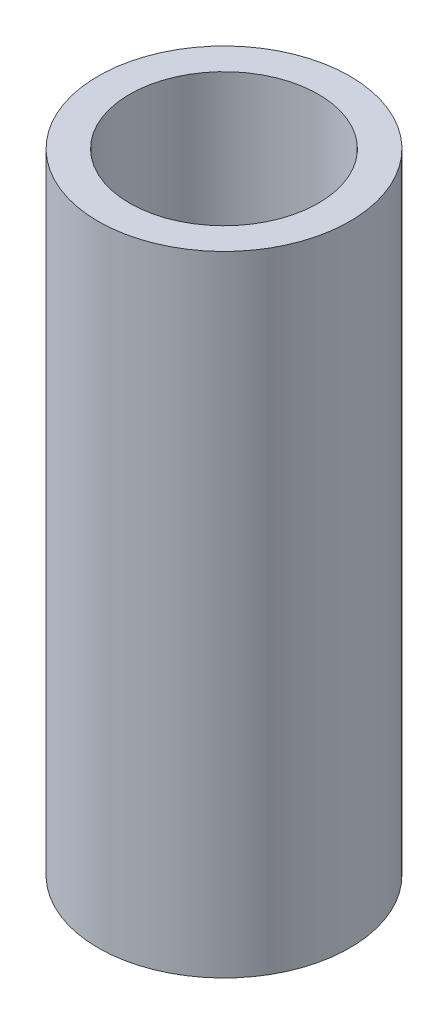
ISO-10303-21;
HEADER;
FILE_DESCRIPTION(('STEP AP214'),'2;1');
FILE_NAME('part.step','',(''),(''),'','','');
FILE_SCHEMA(('AUTOMOTIVE_DESIGN { 1 0 10303 214 1 1 1 1 }'));
ENDSEC;
DATA;
#1=APPLICATION_CONTEXT('core data for automotive mechanical design processes');
#2=APPLICATION_PROTOCOL_DEFINITION('international standard','automotive_design',2000,#1);
#3=PRODUCT_CONTEXT('',#1,'mechanical');
#4=PRODUCT('Part','Part','',(#3));
#5=PRODUCT_RELATED_PRODUCT_CATEGORY('part','',(#4));
#6=PRODUCT_DEFINITION_FORMATION('','',#4);
#7=PRODUCT_DEFINITION_CONTEXT('part definition',#1,'design');
#8=PRODUCT_DEFINITION('design','',#6,#7);
#9=PRODUCT_DEFINITION_SHAPE('','',#8);
#10=(LENGTH_UNIT() NAMED_UNIT(*) SI_UNIT(.MILLI.,.METRE.));
#11=(NAMED_UNIT(*) PLANE_ANGLE_UNIT() SI_UNIT($,.RADIAN.));
#12=(NAMED_UNIT(*) SI_UNIT($,.STERADIAN.) SOLID_ANGLE_UNIT());
#13=UNCERTAINTY_MEASURE_WITH_UNIT(LENGTH_MEASURE(1.E-05),#10,'distance_accuracy_value','');
#14=(GEOMETRIC_REPRESENTATION_CONTEXT(3) GLOBAL_UNCERTAINTY_ASSIGNED_CONTEXT((#13)) GLOBAL_UNIT_ASSIGNED_CONTEXT((#10,
#11,#12)) REPRESENTATION_CONTEXT('',''));
#15=CARTESIAN_POINT('',(0.,0.,0.));
#16=DIRECTION('',(0.,0.,1.));
#17=DIRECTION('',(1.,0.,0.));
#18=AXIS2_PLACEMENT_3D('',#15,#16,#17);
#19=CARTESIAN_POINT('',(0.,50.8,0.));
#20=DIRECTION('',(0.,1.,0.));
#21=DIRECTION('',(0.,0.,1.));
#22=AXIS2_PLACEMENT_3D('',#19,#20,#21);
#23=PLANE('',#22);
#24=CARTESIAN_POINT('',(0.,50.8,0.));
#25=DIRECTION('',(0.,1.,0.));
#26=DIRECTION('',(0.,0.,1.));
#27=AXIS2_PLACEMENT_3D('',#24,#25,#26);
#28=CIRCLE('',#27,10.16);
#29=CARTESIAN_POINT('',(0.,50.8,10.16));
#30=VERTEX_POINT('',#29);
#31=EDGE_CURVE('E10',#30,#30,#28,.T.);
#32=ORIENTED_EDGE('',*,*,#31,.T.);
#33=EDGE_LOOP('',(#32));
#34=FACE_BOUND('',#33,.T.);
#35=CARTESIAN_POINT('',(0.,50.8,0.));
#36=DIRECTION('',(0.,1.,0.));
#37=DIRECTION('',(0.,0.,1.));
#38=AXIS2_PLACEMENT_3D('',#35,#36,#37);
#39=CIRCLE('',#38,7.62);
#40=CARTESIAN_POINT('',(0.,50.8,7.62));
#41=VERTEX_POINT('',#40);
#42=EDGE_CURVE('E56',#41,#41,#39,.T.);
#43=ORIENTED_EDGE('',*,*,#42,.F.);
#44=EDGE_LOOP('',(#43));
#45=FACE_BOUND('',#44,.T.);
#46=ADVANCED_FACE('F43',(#34,#45),#23,.T.);
#47=CARTESIAN_POINT('',(0.,0.,0.));
#48=DIRECTION('',(0.,1.,0.));
#49=DIRECTION('',(0.,0.,1.));
#50=AXIS2_PLACEMENT_3D('',#47,#48,#49);
#51=PLANE('',#50);
#52=CARTESIAN_POINT('',(0.,0.,0.));
#53=DIRECTION('',(0.,1.,0.));
#54=DIRECTION('',(0.,0.,1.));
#55=AXIS2_PLACEMENT_3D('',#52,#53,#54);
#56=CIRCLE('',#55,10.16);
#57=CARTESIAN_POINT('',(0.,0.,10.16));
#58=VERTEX_POINT('',#57);
#59=EDGE_CURVE('E47',#58,#58,#56,.T.);
#60=ORIENTED_EDGE('',*,*,#59,.F.);
#61=EDGE_LOOP('',(#60));
#62=FACE_BOUND('',#61,.T.);
#63=CARTESIAN_POINT('',(0.,0.,0.));
#64=DIRECTION('',(0.,1.,0.));
#65=DIRECTION('',(0.,0.,1.));
#66=AXIS2_PLACEMENT_3D('',#63,#64,#65);
#67=CIRCLE('',#66,7.62);
#68=CARTESIAN_POINT('',(0.,0.,7.62));
#69=VERTEX_POINT('',#68);
#70=EDGE_CURVE('E58',#69,#69,#67,.T.);
#71=ORIENTED_EDGE('',*,*,#70,.T.);
#72=EDGE_LOOP('',(#71));
#73=FACE_BOUND('',#72,.T.);
#74=ADVANCED_FACE('F70',(#62,#73),#51,.F.);
#75=CARTESIAN_POINT('',(0.,50.8,0.));
#76=DIRECTION('',(0.,-1.,0.));
#77=DIRECTION('',(0.,0.,-1.));
#78=AXIS2_PLACEMENT_3D('',#75,#76,#77);
#79=CYLINDRICAL_SURFACE('',#78,10.16);
#80=ORIENTED_EDGE('',*,*,#31,.F.);
#81=EDGE_LOOP('',(#80));
#82=FACE_BOUND('',#81,.T.);
#83=ORIENTED_EDGE('',*,*,#59,.T.);
#84=EDGE_LOOP('',(#83));
#85=FACE_BOUND('',#84,.T.);
#86=ADVANCED_FACE('F45',(#82,#85),#79,.T.);
#87=CARTESIAN_POINT('',(0.,50.8,0.));
#88=DIRECTION('',(0.,-1.,0.));
#89=DIRECTION('',(0.,0.,-1.));
#90=AXIS2_PLACEMENT_3D('',#87,#88,#89);
#91=CYLINDRICAL_SURFACE('',#90,7.62);
#92=ORIENTED_EDGE('',*,*,#42,.T.);
#93=EDGE_LOOP('',(#92));
#94=FACE_BOUND('',#93,.T.);
#95=ORIENTED_EDGE('',*,*,#70,.F.);
#96=EDGE_LOOP('',(#95));
#97=FACE_BOUND('',#96,.T.);
#98=ADVANCED_FACE('F66',(#94,#97),#91,.F.);
#99=CLOSED_SHELL('',(#46,#74,#86,#98));
#100=MANIFOLD_SOLID_BREP('B2',#99);
#101=ADVANCED_BREP_SHAPE_REPRESENTATION('',(#18,#100),#14);
#102=SHAPE_DEFINITION_REPRESENTATION(#9,#101);
ENDSEC;
END-ISO-10303-21;
